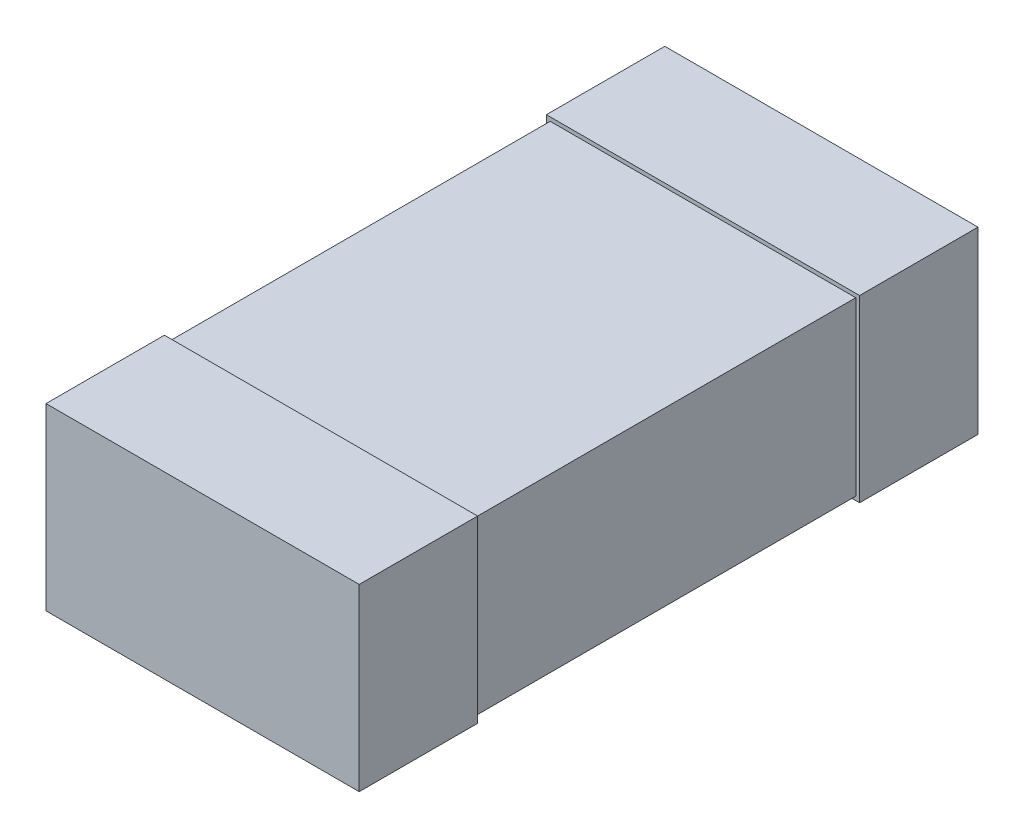
ISO-10303-21;
HEADER;
FILE_DESCRIPTION(('STEP AP214'),'2;1');
FILE_NAME('part.step','',(''),(''),'','','');
FILE_SCHEMA(('AUTOMOTIVE_DESIGN { 1 0 10303 214 1 1 1 1 }'));
ENDSEC;
DATA;
#1=APPLICATION_CONTEXT('core data for automotive mechanical design processes');
#2=APPLICATION_PROTOCOL_DEFINITION('international standard','automotive_design',2000,#1);
#3=PRODUCT_CONTEXT('',#1,'mechanical');
#4=PRODUCT('Part','Part','',(#3));
#5=PRODUCT_RELATED_PRODUCT_CATEGORY('part','',(#4));
#6=PRODUCT_DEFINITION_FORMATION('','',#4);
#7=PRODUCT_DEFINITION_CONTEXT('part definition',#1,'design');
#8=PRODUCT_DEFINITION('design','',#6,#7);
#9=PRODUCT_DEFINITION_SHAPE('','',#8);
#10=(LENGTH_UNIT() NAMED_UNIT(*) SI_UNIT(.MILLI.,.METRE.));
#11=(NAMED_UNIT(*) PLANE_ANGLE_UNIT() SI_UNIT($,.RADIAN.));
#12=(NAMED_UNIT(*) SI_UNIT($,.STERADIAN.) SOLID_ANGLE_UNIT());
#13=UNCERTAINTY_MEASURE_WITH_UNIT(LENGTH_MEASURE(1.E-05),#10,'distance_accuracy_value','');
#14=(GEOMETRIC_REPRESENTATION_CONTEXT(3) GLOBAL_UNCERTAINTY_ASSIGNED_CONTEXT((#13)) GLOBAL_UNIT_ASSIGNED_CONTEXT((#10,
#11,#12)) REPRESENTATION_CONTEXT('',''));
#15=CARTESIAN_POINT('',(0.,0.,0.));
#16=DIRECTION('',(0.,0.,1.));
#17=DIRECTION('',(1.,0.,0.));
#18=AXIS2_PLACEMENT_3D('',#15,#16,#17);
#19=CARTESIAN_POINT('',(-0.41,-0.01,0.81));
#20=DIRECTION('',(0.,0.,1.));
#21=DIRECTION('',(1.,0.,0.));
#22=AXIS2_PLACEMENT_3D('',#19,#20,#21);
#23=PLANE('',#22);
#24=DIRECTION('',(0.,1.,0.));
#25=VECTOR('',#24,1.);
#26=CARTESIAN_POINT('',(0.41,-0.01,0.81));
#27=LINE('',#26,#25);
#28=CARTESIAN_POINT('',(0.41,0.46,0.81));
#29=VERTEX_POINT('',#28);
#30=CARTESIAN_POINT('',(0.41,-0.01,0.81));
#31=VERTEX_POINT('',#30);
#32=EDGE_CURVE('E107',#29,#31,#27,.F.);
#33=ORIENTED_EDGE('',*,*,#32,.F.);
#34=DIRECTION('',(1.,0.,0.));
#35=VECTOR('',#34,1.);
#36=CARTESIAN_POINT('',(0.41,0.46,0.81));
#37=LINE('',#36,#35);
#38=CARTESIAN_POINT('',(-0.41,0.46,0.81));
#39=VERTEX_POINT('',#38);
#40=EDGE_CURVE('E102',#39,#29,#37,.T.);
#41=ORIENTED_EDGE('',*,*,#40,.F.);
#42=DIRECTION('',(0.,1.,0.));
#43=VECTOR('',#42,1.);
#44=CARTESIAN_POINT('',(-0.41,0.46,0.81));
#45=LINE('',#44,#43);
#46=CARTESIAN_POINT('',(-0.41,-0.01,0.81));
#47=VERTEX_POINT('',#46);
#48=EDGE_CURVE('E117',#47,#39,#45,.T.);
#49=ORIENTED_EDGE('',*,*,#48,.F.);
#50=DIRECTION('',(1.,0.,0.));
#51=VECTOR('',#50,1.);
#52=CARTESIAN_POINT('',(-0.41,-0.01,0.81));
#53=LINE('',#52,#51);
#54=EDGE_CURVE('E19',#31,#47,#53,.F.);
#55=ORIENTED_EDGE('',*,*,#54,.F.);
#56=EDGE_LOOP('',(#33,#41,#49,#55));
#57=FACE_BOUND('',#56,.T.);
#58=ADVANCED_FACE('F16',(#57),#23,.T.);
#59=CARTESIAN_POINT('',(-0.41,-0.01,-0.81));
#60=DIRECTION('',(0.,0.,-1.));
#61=DIRECTION('',(-1.,0.,0.));
#62=AXIS2_PLACEMENT_3D('',#59,#60,#61);
#63=PLANE('',#62);
#64=DIRECTION('',(0.,1.,0.));
#65=VECTOR('',#64,1.);
#66=CARTESIAN_POINT('',(0.41,-0.01,-0.81));
#67=LINE('',#66,#65);
#68=CARTESIAN_POINT('',(0.41,0.46,-0.81));
#69=VERTEX_POINT('',#68);
#70=CARTESIAN_POINT('',(0.41,-0.01,-0.81));
#71=VERTEX_POINT('',#70);
#72=EDGE_CURVE('E138',#69,#71,#67,.F.);
#73=ORIENTED_EDGE('',*,*,#72,.T.);
#74=DIRECTION('',(1.,0.,0.));
#75=VECTOR('',#74,1.);
#76=CARTESIAN_POINT('',(-0.41,-0.01,-0.81));
#77=LINE('',#76,#75);
#78=CARTESIAN_POINT('',(-0.41,-0.01,-0.81));
#79=VERTEX_POINT('',#78);
#80=EDGE_CURVE('E143',#71,#79,#77,.F.);
#81=ORIENTED_EDGE('',*,*,#80,.T.);
#82=DIRECTION('',(0.,1.,0.));
#83=VECTOR('',#82,1.);
#84=CARTESIAN_POINT('',(-0.41,0.46,-0.81));
#85=LINE('',#84,#83);
#86=CARTESIAN_POINT('',(-0.41,0.46,-0.81));
#87=VERTEX_POINT('',#86);
#88=EDGE_CURVE('E148',#79,#87,#85,.T.);
#89=ORIENTED_EDGE('',*,*,#88,.T.);
#90=DIRECTION('',(1.,0.,0.));
#91=VECTOR('',#90,1.);
#92=CARTESIAN_POINT('',(0.41,0.46,-0.81));
#93=LINE('',#92,#91);
#94=EDGE_CURVE('E133',#87,#69,#93,.T.);
#95=ORIENTED_EDGE('',*,*,#94,.T.);
#96=EDGE_LOOP('',(#73,#81,#89,#95));
#97=FACE_BOUND('',#96,.T.);
#98=ADVANCED_FACE('F262',(#97),#63,.T.);
#99=CARTESIAN_POINT('',(-0.41,-0.01,0.5));
#100=DIRECTION('',(0.,-1.,0.));
#101=DIRECTION('',(0.,0.,-1.));
#102=AXIS2_PLACEMENT_3D('',#99,#100,#101);
#103=PLANE('',#102);
#104=DIRECTION('',(0.,0.,1.));
#105=VECTOR('',#104,1.);
#106=CARTESIAN_POINT('',(-0.41,-0.01,0.5));
#107=LINE('',#106,#105);
#108=CARTESIAN_POINT('',(-0.41,-0.01,0.5));
#109=VERTEX_POINT('',#108);
#110=EDGE_CURVE('E128',#109,#47,#107,.T.);
#111=ORIENTED_EDGE('',*,*,#110,.F.);
#112=DIRECTION('',(1.,0.,0.));
#113=VECTOR('',#112,1.);
#114=CARTESIAN_POINT('',(-0.41,-0.01,0.5));
#115=LINE('',#114,#113);
#116=CARTESIAN_POINT('',(0.41,-0.01,0.5));
#117=VERTEX_POINT('',#116);
#118=EDGE_CURVE('E123',#109,#117,#115,.T.);
#119=ORIENTED_EDGE('',*,*,#118,.T.);
#120=DIRECTION('',(0.,0.,-1.));
#121=VECTOR('',#120,1.);
#122=CARTESIAN_POINT('',(0.41,-0.01,0.5));
#123=LINE('',#122,#121);
#124=EDGE_CURVE('E112',#31,#117,#123,.T.);
#125=ORIENTED_EDGE('',*,*,#124,.F.);
#126=ORIENTED_EDGE('',*,*,#54,.T.);
#127=EDGE_LOOP('',(#111,#119,#125,#126));
#128=FACE_BOUND('',#127,.T.);
#129=ADVANCED_FACE('F122',(#128),#103,.T.);
#130=CARTESIAN_POINT('',(0.41,-0.01,0.5));
#131=DIRECTION('',(1.,0.,0.));
#132=DIRECTION('',(0.,0.,-1.));
#133=AXIS2_PLACEMENT_3D('',#130,#131,#132);
#134=PLANE('',#133);
#135=ORIENTED_EDGE('',*,*,#124,.T.);
#136=DIRECTION('',(0.,1.,0.));
#137=VECTOR('',#136,1.);
#138=CARTESIAN_POINT('',(0.41,-0.01,0.5));
#139=LINE('',#138,#137);
#140=CARTESIAN_POINT('',(0.41,0.46,0.5));
#141=VERTEX_POINT('',#140);
#142=EDGE_CURVE('E162',#117,#141,#139,.T.);
#143=ORIENTED_EDGE('',*,*,#142,.T.);
#144=DIRECTION('',(0.,0.,1.));
#145=VECTOR('',#144,1.);
#146=CARTESIAN_POINT('',(0.41,0.46,0.5));
#147=LINE('',#146,#145);
#148=EDGE_CURVE('E114',#29,#141,#147,.F.);
#149=ORIENTED_EDGE('',*,*,#148,.F.);
#150=ORIENTED_EDGE('',*,*,#32,.T.);
#151=EDGE_LOOP('',(#135,#143,#149,#150));
#152=FACE_BOUND('',#151,.T.);
#153=ADVANCED_FACE('F109',(#152),#134,.T.);
#154=CARTESIAN_POINT('',(0.41,0.46,0.5));
#155=DIRECTION('',(0.,1.,0.));
#156=DIRECTION('',(0.,0.,1.));
#157=AXIS2_PLACEMENT_3D('',#154,#155,#156);
#158=PLANE('',#157);
#159=ORIENTED_EDGE('',*,*,#148,.T.);
#160=DIRECTION('',(1.,0.,0.));
#161=VECTOR('',#160,1.);
#162=CARTESIAN_POINT('',(-0.41,0.46,0.5));
#163=LINE('',#162,#161);
#164=CARTESIAN_POINT('',(-0.41,0.46,0.5));
#165=VERTEX_POINT('',#164);
#166=EDGE_CURVE('E164',#141,#165,#163,.F.);
#167=ORIENTED_EDGE('',*,*,#166,.T.);
#168=DIRECTION('',(0.,0.,1.));
#169=VECTOR('',#168,1.);
#170=CARTESIAN_POINT('',(-0.41,0.46,0.5));
#171=LINE('',#170,#169);
#172=EDGE_CURVE('E131',#39,#165,#171,.F.);
#173=ORIENTED_EDGE('',*,*,#172,.F.);
#174=ORIENTED_EDGE('',*,*,#40,.T.);
#175=EDGE_LOOP('',(#159,#167,#173,#174));
#176=FACE_BOUND('',#175,.T.);
#177=ADVANCED_FACE('F255',(#176),#158,.T.);
#178=CARTESIAN_POINT('',(-0.41,0.46,0.5));
#179=DIRECTION('',(-1.,0.,0.));
#180=DIRECTION('',(0.,0.,1.));
#181=AXIS2_PLACEMENT_3D('',#178,#179,#180);
#182=PLANE('',#181);
#183=ORIENTED_EDGE('',*,*,#172,.T.);
#184=DIRECTION('',(0.,1.,0.));
#185=VECTOR('',#184,1.);
#186=CARTESIAN_POINT('',(-0.41,-0.01,0.5));
#187=LINE('',#186,#185);
#188=EDGE_CURVE('E167',#165,#109,#187,.F.);
#189=ORIENTED_EDGE('',*,*,#188,.T.);
#190=ORIENTED_EDGE('',*,*,#110,.T.);
#191=ORIENTED_EDGE('',*,*,#48,.T.);
#192=EDGE_LOOP('',(#183,#189,#190,#191));
#193=FACE_BOUND('',#192,.T.);
#194=ADVANCED_FACE('F251',(#193),#182,.T.);
#195=CARTESIAN_POINT('',(-0.4,0.45,0.8));
#196=DIRECTION('',(0.,1.,0.));
#197=DIRECTION('',(0.,0.,1.));
#198=AXIS2_PLACEMENT_3D('',#195,#196,#197);
#199=PLANE('',#198);
#200=DIRECTION('',(0.,0.,-1.));
#201=VECTOR('',#200,1.);
#202=CARTESIAN_POINT('',(-0.4,0.45,-0.8));
#203=LINE('',#202,#201);
#204=CARTESIAN_POINT('',(-0.4,0.45,-0.5));
#205=VERTEX_POINT('',#204);
#206=CARTESIAN_POINT('',(-0.4,0.45,0.5));
#207=VERTEX_POINT('',#206);
#208=EDGE_CURVE('E154',#205,#207,#203,.F.);
#209=ORIENTED_EDGE('',*,*,#208,.T.);
#210=DIRECTION('',(1.,0.,0.));
#211=VECTOR('',#210,1.);
#212=CARTESIAN_POINT('',(-0.41,0.45,0.5));
#213=LINE('',#212,#211);
#214=CARTESIAN_POINT('',(0.4,0.45,0.5));
#215=VERTEX_POINT('',#214);
#216=EDGE_CURVE('E159',#207,#215,#213,.T.);
#217=ORIENTED_EDGE('',*,*,#216,.T.);
#218=DIRECTION('',(0.,0.,1.));
#219=VECTOR('',#218,1.);
#220=CARTESIAN_POINT('',(0.4,0.45,-0.8));
#221=LINE('',#220,#219);
#222=CARTESIAN_POINT('',(0.4,0.45,-0.5));
#223=VERTEX_POINT('',#222);
#224=EDGE_CURVE('E173',#215,#223,#221,.F.);
#225=ORIENTED_EDGE('',*,*,#224,.T.);
#226=DIRECTION('',(-1.,0.,0.));
#227=VECTOR('',#226,1.);
#228=CARTESIAN_POINT('',(-0.41,0.45,-0.5));
#229=LINE('',#228,#227);
#230=EDGE_CURVE('E179',#223,#205,#229,.T.);
#231=ORIENTED_EDGE('',*,*,#230,.T.);
#232=EDGE_LOOP('',(#209,#217,#225,#231));
#233=FACE_BOUND('',#232,.T.);
#234=ADVANCED_FACE('F247',(#233),#199,.T.);
#235=CARTESIAN_POINT('',(0.41,0.46,-0.5));
#236=DIRECTION('',(0.,-1.,0.));
#237=DIRECTION('',(0.,0.,-1.));
#238=AXIS2_PLACEMENT_3D('',#235,#236,#237);
#239=PLANE('',#238);
#240=ORIENTED_EDGE('',*,*,#94,.F.);
#241=DIRECTION('',(0.,0.,-1.));
#242=VECTOR('',#241,1.);
#243=CARTESIAN_POINT('',(-0.41,0.46,-0.5));
#244=LINE('',#243,#242);
#245=CARTESIAN_POINT('',(-0.41,0.46,-0.5));
#246=VERTEX_POINT('',#245);
#247=EDGE_CURVE('E151',#87,#246,#244,.F.);
#248=ORIENTED_EDGE('',*,*,#247,.T.);
#249=DIRECTION('',(-1.,0.,0.));
#250=VECTOR('',#249,1.);
#251=CARTESIAN_POINT('',(-0.41,0.46,-0.5));
#252=LINE('',#251,#250);
#253=CARTESIAN_POINT('',(0.41,0.46,-0.5));
#254=VERTEX_POINT('',#253);
#255=EDGE_CURVE('E182',#246,#254,#252,.F.);
#256=ORIENTED_EDGE('',*,*,#255,.T.);
#257=DIRECTION('',(0.,0.,1.));
#258=VECTOR('',#257,1.);
#259=CARTESIAN_POINT('',(0.41,0.46,-0.5));
#260=LINE('',#259,#258);
#261=EDGE_CURVE('E135',#254,#69,#260,.F.);
#262=ORIENTED_EDGE('',*,*,#261,.T.);
#263=EDGE_LOOP('',(#240,#248,#256,#262));
#264=FACE_BOUND('',#263,.T.);
#265=ADVANCED_FACE('F243',(#264),#239,.F.);
#266=CARTESIAN_POINT('',(0.41,-0.01,-0.5));
#267=DIRECTION('',(-1.,0.,0.));
#268=DIRECTION('',(0.,0.,1.));
#269=AXIS2_PLACEMENT_3D('',#266,#267,#268);
#270=PLANE('',#269);
#271=ORIENTED_EDGE('',*,*,#72,.F.);
#272=ORIENTED_EDGE('',*,*,#261,.F.);
#273=DIRECTION('',(0.,1.,0.));
#274=VECTOR('',#273,1.);
#275=CARTESIAN_POINT('',(0.41,-0.01,-0.5));
#276=LINE('',#275,#274);
#277=CARTESIAN_POINT('',(0.41,-0.01,-0.5));
#278=VERTEX_POINT('',#277);
#279=EDGE_CURVE('E185',#254,#278,#276,.F.);
#280=ORIENTED_EDGE('',*,*,#279,.T.);
#281=DIRECTION('',(0.,0.,1.));
#282=VECTOR('',#281,1.);
#283=CARTESIAN_POINT('',(0.41,-0.01,-0.5));
#284=LINE('',#283,#282);
#285=EDGE_CURVE('E140',#278,#71,#284,.F.);
#286=ORIENTED_EDGE('',*,*,#285,.T.);
#287=EDGE_LOOP('',(#271,#272,#280,#286));
#288=FACE_BOUND('',#287,.T.);
#289=ADVANCED_FACE('F239',(#288),#270,.F.);
#290=CARTESIAN_POINT('',(-0.41,-0.01,-0.5));
#291=DIRECTION('',(0.,1.,0.));
#292=DIRECTION('',(0.,0.,1.));
#293=AXIS2_PLACEMENT_3D('',#290,#291,#292);
#294=PLANE('',#293);
#295=ORIENTED_EDGE('',*,*,#80,.F.);
#296=ORIENTED_EDGE('',*,*,#285,.F.);
#297=DIRECTION('',(-1.,0.,0.));
#298=VECTOR('',#297,1.);
#299=CARTESIAN_POINT('',(-0.41,-0.01,-0.5));
#300=LINE('',#299,#298);
#301=CARTESIAN_POINT('',(-0.41,-0.01,-0.5));
#302=VERTEX_POINT('',#301);
#303=EDGE_CURVE('E188',#278,#302,#300,.T.);
#304=ORIENTED_EDGE('',*,*,#303,.T.);
#305=DIRECTION('',(0.,0.,-1.));
#306=VECTOR('',#305,1.);
#307=CARTESIAN_POINT('',(-0.41,-0.01,-0.5));
#308=LINE('',#307,#306);
#309=EDGE_CURVE('E145',#302,#79,#308,.T.);
#310=ORIENTED_EDGE('',*,*,#309,.T.);
#311=EDGE_LOOP('',(#295,#296,#304,#310));
#312=FACE_BOUND('',#311,.T.);
#313=ADVANCED_FACE('F235',(#312),#294,.F.);
#314=CARTESIAN_POINT('',(-0.41,0.46,-0.5));
#315=DIRECTION('',(1.,0.,0.));
#316=DIRECTION('',(0.,0.,-1.));
#317=AXIS2_PLACEMENT_3D('',#314,#315,#316);
#318=PLANE('',#317);
#319=ORIENTED_EDGE('',*,*,#88,.F.);
#320=ORIENTED_EDGE('',*,*,#309,.F.);
#321=DIRECTION('',(0.,1.,0.));
#322=VECTOR('',#321,1.);
#323=CARTESIAN_POINT('',(-0.41,-0.01,-0.5));
#324=LINE('',#323,#322);
#325=EDGE_CURVE('E191',#302,#246,#324,.T.);
#326=ORIENTED_EDGE('',*,*,#325,.T.);
#327=ORIENTED_EDGE('',*,*,#247,.F.);
#328=EDGE_LOOP('',(#319,#320,#326,#327));
#329=FACE_BOUND('',#328,.T.);
#330=ADVANCED_FACE('F232',(#329),#318,.F.);
#331=CARTESIAN_POINT('',(-0.4,0.45,-0.8));
#332=DIRECTION('',(1.,0.,0.));
#333=DIRECTION('',(0.,0.,-1.));
#334=AXIS2_PLACEMENT_3D('',#331,#332,#333);
#335=PLANE('',#334);
#336=DIRECTION('',(0.,0.,1.));
#337=VECTOR('',#336,1.);
#338=CARTESIAN_POINT('',(-0.4,0.,0.8));
#339=LINE('',#338,#337);
#340=CARTESIAN_POINT('',(-0.4,0.,-0.5));
#341=VERTEX_POINT('',#340);
#342=CARTESIAN_POINT('',(-0.4,0.,0.5));
#343=VERTEX_POINT('',#342);
#344=EDGE_CURVE('E194',#341,#343,#339,.T.);
#345=ORIENTED_EDGE('',*,*,#344,.T.);
#346=DIRECTION('',(0.,1.,0.));
#347=VECTOR('',#346,1.);
#348=CARTESIAN_POINT('',(-0.4,-0.01,0.5));
#349=LINE('',#348,#347);
#350=EDGE_CURVE('E156',#343,#207,#349,.T.);
#351=ORIENTED_EDGE('',*,*,#350,.T.);
#352=ORIENTED_EDGE('',*,*,#208,.F.);
#353=DIRECTION('',(0.,1.,0.));
#354=VECTOR('',#353,1.);
#355=CARTESIAN_POINT('',(-0.4,-0.01,-0.5));
#356=LINE('',#355,#354);
#357=EDGE_CURVE('E175',#205,#341,#356,.F.);
#358=ORIENTED_EDGE('',*,*,#357,.T.);
#359=EDGE_LOOP('',(#345,#351,#352,#358));
#360=FACE_BOUND('',#359,.T.);
#361=ADVANCED_FACE('F212',(#360),#335,.F.);
#362=CARTESIAN_POINT('',(-0.41,-0.01,0.5));
#363=DIRECTION('',(0.,0.,1.));
#364=DIRECTION('',(1.,0.,0.));
#365=AXIS2_PLACEMENT_3D('',#362,#363,#364);
#366=PLANE('',#365);
#367=ORIENTED_EDGE('',*,*,#166,.F.);
#368=ORIENTED_EDGE('',*,*,#142,.F.);
#369=ORIENTED_EDGE('',*,*,#118,.F.);
#370=ORIENTED_EDGE('',*,*,#188,.F.);
#371=EDGE_LOOP('',(#367,#368,#369,#370));
#372=FACE_BOUND('',#371,.T.);
#373=ORIENTED_EDGE('',*,*,#350,.F.);
#374=DIRECTION('',(1.,0.,0.));
#375=VECTOR('',#374,1.);
#376=CARTESIAN_POINT('',(-0.4,0.,0.5));
#377=LINE('',#376,#375);
#378=CARTESIAN_POINT('',(0.4,0.,0.5));
#379=VERTEX_POINT('',#378);
#380=EDGE_CURVE('E197',#343,#379,#377,.T.);
#381=ORIENTED_EDGE('',*,*,#380,.T.);
#382=DIRECTION('',(0.,1.,0.));
#383=VECTOR('',#382,1.);
#384=CARTESIAN_POINT('',(0.4,0.45,0.5));
#385=LINE('',#384,#383);
#386=EDGE_CURVE('E170',#379,#215,#385,.T.);
#387=ORIENTED_EDGE('',*,*,#386,.T.);
#388=ORIENTED_EDGE('',*,*,#216,.F.);
#389=EDGE_LOOP('',(#373,#381,#387,#388));
#390=FACE_BOUND('',#389,.T.);
#391=ADVANCED_FACE('F209',(#372,#390),#366,.F.);
#392=CARTESIAN_POINT('',(0.4,0.45,-0.8));
#393=DIRECTION('',(-1.,0.,0.));
#394=DIRECTION('',(0.,0.,1.));
#395=AXIS2_PLACEMENT_3D('',#392,#393,#394);
#396=PLANE('',#395);
#397=ORIENTED_EDGE('',*,*,#224,.F.);
#398=ORIENTED_EDGE('',*,*,#386,.F.);
#399=DIRECTION('',(0.,0.,1.));
#400=VECTOR('',#399,1.);
#401=CARTESIAN_POINT('',(0.4,0.,0.8));
#402=LINE('',#401,#400);
#403=CARTESIAN_POINT('',(0.4,0.,-0.5));
#404=VERTEX_POINT('',#403);
#405=EDGE_CURVE('E25',#379,#404,#402,.F.);
#406=ORIENTED_EDGE('',*,*,#405,.T.);
#407=DIRECTION('',(0.,1.,0.));
#408=VECTOR('',#407,1.);
#409=CARTESIAN_POINT('',(0.4,-0.01,-0.5));
#410=LINE('',#409,#408);
#411=EDGE_CURVE('E33',#404,#223,#410,.T.);
#412=ORIENTED_EDGE('',*,*,#411,.T.);
#413=EDGE_LOOP('',(#397,#398,#406,#412));
#414=FACE_BOUND('',#413,.T.);
#415=ADVANCED_FACE('F204',(#414),#396,.F.);
#416=CARTESIAN_POINT('',(-0.41,-0.01,-0.5));
#417=DIRECTION('',(0.,0.,-1.));
#418=DIRECTION('',(-1.,0.,0.));
#419=AXIS2_PLACEMENT_3D('',#416,#417,#418);
#420=PLANE('',#419);
#421=ORIENTED_EDGE('',*,*,#303,.F.);
#422=ORIENTED_EDGE('',*,*,#279,.F.);
#423=ORIENTED_EDGE('',*,*,#255,.F.);
#424=ORIENTED_EDGE('',*,*,#325,.F.);
#425=EDGE_LOOP('',(#421,#422,#423,#424));
#426=FACE_BOUND('',#425,.T.);
#427=ORIENTED_EDGE('',*,*,#411,.F.);
#428=DIRECTION('',(1.,0.,0.));
#429=VECTOR('',#428,1.);
#430=CARTESIAN_POINT('',(-0.4,0.,-0.5));
#431=LINE('',#430,#429);
#432=EDGE_CURVE('E10',#404,#341,#431,.F.);
#433=ORIENTED_EDGE('',*,*,#432,.T.);
#434=ORIENTED_EDGE('',*,*,#357,.F.);
#435=ORIENTED_EDGE('',*,*,#230,.F.);
#436=EDGE_LOOP('',(#427,#433,#434,#435));
#437=FACE_BOUND('',#436,.T.);
#438=ADVANCED_FACE('F214',(#426,#437),#420,.F.);
#439=CARTESIAN_POINT('',(-0.4,0.,0.8));
#440=DIRECTION('',(0.,1.,0.));
#441=DIRECTION('',(0.,0.,1.));
#442=AXIS2_PLACEMENT_3D('',#439,#440,#441);
#443=PLANE('',#442);
#444=ORIENTED_EDGE('',*,*,#405,.F.);
#445=ORIENTED_EDGE('',*,*,#380,.F.);
#446=ORIENTED_EDGE('',*,*,#344,.F.);
#447=ORIENTED_EDGE('',*,*,#432,.F.);
#448=EDGE_LOOP('',(#444,#445,#446,#447));
#449=FACE_BOUND('',#448,.T.);
#450=ADVANCED_FACE('F207',(#449),#443,.F.);
#451=CLOSED_SHELL('',(#58,#98,#129,#153,#177,#194,#234,#265,#289,#313,#330,#361,#391,#415,#438,#450));
#452=MANIFOLD_SOLID_BREP('B1',#451);
#453=ADVANCED_BREP_SHAPE_REPRESENTATION('',(#18,#452),#14);
#454=SHAPE_DEFINITION_REPRESENTATION(#9,#453);
ENDSEC;
END-ISO-10303-21;
